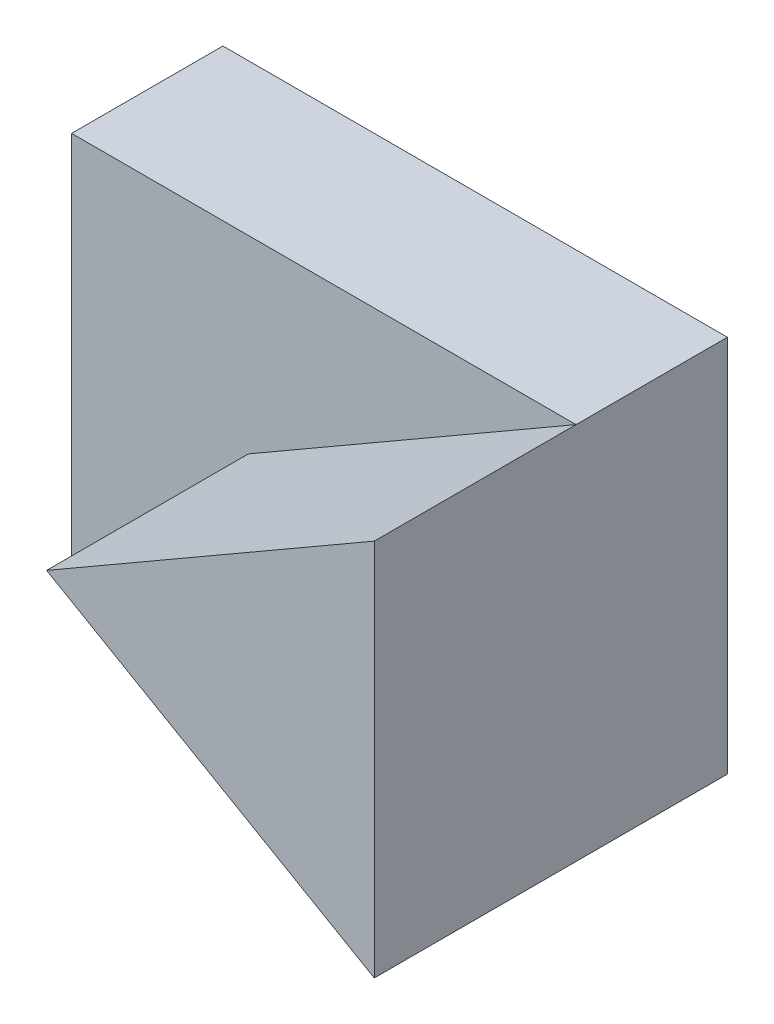
ISO-10303-21;
HEADER;
FILE_DESCRIPTION(('STEP AP214'),'2;1');
FILE_NAME('part.step','',(''),(''),'','','');
FILE_SCHEMA(('AUTOMOTIVE_DESIGN { 1 0 10303 214 1 1 1 1 }'));
ENDSEC;
DATA;
#1=APPLICATION_CONTEXT('core data for automotive mechanical design processes');
#2=APPLICATION_PROTOCOL_DEFINITION('international standard','automotive_design',2000,#1);
#3=PRODUCT_CONTEXT('',#1,'mechanical');
#4=PRODUCT('Part','Part','',(#3));
#5=PRODUCT_RELATED_PRODUCT_CATEGORY('part','',(#4));
#6=PRODUCT_DEFINITION_FORMATION('','',#4);
#7=PRODUCT_DEFINITION_CONTEXT('part definition',#1,'design');
#8=PRODUCT_DEFINITION('design','',#6,#7);
#9=PRODUCT_DEFINITION_SHAPE('','',#8);
#10=(LENGTH_UNIT() NAMED_UNIT(*) SI_UNIT(.MILLI.,.METRE.));
#11=(NAMED_UNIT(*) PLANE_ANGLE_UNIT() SI_UNIT($,.RADIAN.));
#12=(NAMED_UNIT(*) SI_UNIT($,.STERADIAN.) SOLID_ANGLE_UNIT());
#13=UNCERTAINTY_MEASURE_WITH_UNIT(LENGTH_MEASURE(1.E-05),#10,'distance_accuracy_value','');
#14=(GEOMETRIC_REPRESENTATION_CONTEXT(3) GLOBAL_UNCERTAINTY_ASSIGNED_CONTEXT((#13)) GLOBAL_UNIT_ASSIGNED_CONTEXT((#10,
#11,#12)) REPRESENTATION_CONTEXT('',''));
#15=CARTESIAN_POINT('',(0.,0.,0.));
#16=DIRECTION('',(0.,0.,1.));
#17=DIRECTION('',(1.,0.,0.));
#18=AXIS2_PLACEMENT_3D('',#15,#16,#17);
#19=CARTESIAN_POINT('',(0.,0.,3.));
#20=DIRECTION('',(0.,0.,1.));
#21=DIRECTION('',(1.,0.,0.));
#22=AXIS2_PLACEMENT_3D('',#19,#20,#21);
#23=PLANE('',#22);
#24=DIRECTION('',(1.,0.,0.));
#25=VECTOR('',#24,1.);
#26=CARTESIAN_POINT('',(-17.0149253731343,0.,3.));
#27=LINE('',#26,#25);
#28=CARTESIAN_POINT('',(-7.01492537313434,0.,3.));
#29=VERTEX_POINT('',#28);
#30=CARTESIAN_POINT('',(2.98507462686566,0.,3.));
#31=VERTEX_POINT('',#30);
#32=EDGE_CURVE('E149',#29,#31,#27,.T.);
#33=ORIENTED_EDGE('',*,*,#32,.T.);
#34=DIRECTION('',(0.866025403784439,-0.5,0.));
#35=VECTOR('',#34,1.);
#36=CARTESIAN_POINT('',(-10.0053064299009,7.5,3.));
#37=LINE('',#36,#35);
#38=CARTESIAN_POINT('',(-3.51011590151763,3.75,3.));
#39=VERTEX_POINT('',#38);
#40=EDGE_CURVE('E207',#39,#31,#37,.T.);
#41=ORIENTED_EDGE('',*,*,#40,.F.);
#42=DIRECTION('',(-0.682818860949668,-0.730587710772223,0.));
#43=VECTOR('',#42,1.);
#44=CARTESIAN_POINT('',(-3.51011590151763,3.75,3.));
#45=LINE('',#44,#43);
#46=EDGE_CURVE('E164',#39,#29,#45,.T.);
#47=ORIENTED_EDGE('',*,*,#46,.T.);
#48=EDGE_LOOP('',(#33,#41,#47));
#49=FACE_BOUND('',#48,.T.);
#50=ADVANCED_FACE('F64',(#49),#23,.T.);
#51=DIRECTION('',(-0.682818860949668,-0.730587710772223,0.));
#52=VECTOR('',#51,1.);
#53=CARTESIAN_POINT('',(-4.37614130530207,4.25,3.));
#54=LINE('',#53,#52);
#55=CARTESIAN_POINT('',(-4.37614130530207,4.25,3.));
#56=VERTEX_POINT('',#55);
#57=CARTESIAN_POINT('',(-7.88095077691878,0.5,3.));
#58=VERTEX_POINT('',#57);
#59=EDGE_CURVE('E82',#56,#58,#54,.T.);
#60=ORIENTED_EDGE('',*,*,#59,.F.);
#61=CARTESIAN_POINT('',(-10.0053064299009,7.5,3.));
#62=VERTEX_POINT('',#61);
#63=EDGE_CURVE('E209',#62,#56,#37,.T.);
#64=ORIENTED_EDGE('',*,*,#63,.F.);
#65=DIRECTION('',(-0.866025403784439,-0.5,0.));
#66=VECTOR('',#65,1.);
#67=CARTESIAN_POINT('',(2.98507462686566,15.,3.));
#68=LINE('',#67,#66);
#69=CARTESIAN_POINT('',(2.98507462686566,15.,3.));
#70=VERTEX_POINT('',#69);
#71=EDGE_CURVE('E191',#70,#62,#68,.T.);
#72=ORIENTED_EDGE('',*,*,#71,.F.);
#73=DIRECTION('',(-1.,0.,0.));
#74=VECTOR('',#73,1.);
#75=CARTESIAN_POINT('',(-17.0149253731343,15.,3.));
#76=LINE('',#75,#74);
#77=CARTESIAN_POINT('',(-17.0149253731343,15.,3.));
#78=VERTEX_POINT('',#77);
#79=EDGE_CURVE('E122',#70,#78,#76,.T.);
#80=ORIENTED_EDGE('',*,*,#79,.T.);
#81=DIRECTION('',(0.,-1.,0.));
#82=VECTOR('',#81,1.);
#83=CARTESIAN_POINT('',(-17.0149253731343,15.,3.));
#84=LINE('',#83,#82);
#85=CARTESIAN_POINT('',(-17.0149253731343,0.,3.));
#86=VERTEX_POINT('',#85);
#87=EDGE_CURVE('E91',#78,#86,#84,.T.);
#88=ORIENTED_EDGE('',*,*,#87,.T.);
#89=EDGE_CURVE('E68',#86,#29,#27,.T.);
#90=ORIENTED_EDGE('',*,*,#89,.T.);
#91=DIRECTION('',(-0.866025403784439,0.5,0.));
#92=VECTOR('',#91,1.);
#93=CARTESIAN_POINT('',(-7.01492537313434,0.,3.));
#94=LINE('',#93,#92);
#95=EDGE_CURVE('E157',#29,#58,#94,.T.);
#96=ORIENTED_EDGE('',*,*,#95,.T.);
#97=EDGE_LOOP('',(#60,#64,#72,#80,#88,#90,#96));
#98=FACE_BOUND('',#97,.T.);
#99=ADVANCED_FACE('F233',(#98),#23,.T.);
#100=CARTESIAN_POINT('',(2.98507462686566,15.,3.));
#101=DIRECTION('',(-1.,0.,0.));
#102=DIRECTION('',(0.,-1.,0.));
#103=AXIS2_PLACEMENT_3D('',#100,#101,#102);
#104=PLANE('',#103);
#105=DIRECTION('',(0.,1.,0.));
#106=VECTOR('',#105,1.);
#107=CARTESIAN_POINT('',(2.98507462686566,15.,-3.));
#108=LINE('',#107,#106);
#109=CARTESIAN_POINT('',(2.98507462686566,0.,-3.));
#110=VERTEX_POINT('',#109);
#111=CARTESIAN_POINT('',(2.98507462686566,15.,-3.));
#112=VERTEX_POINT('',#111);
#113=EDGE_CURVE('E129',#110,#112,#108,.T.);
#114=ORIENTED_EDGE('',*,*,#113,.T.);
#115=DIRECTION('',(0.,0.,-1.));
#116=VECTOR('',#115,1.);
#117=CARTESIAN_POINT('',(2.98507462686566,15.,3.));
#118=LINE('',#117,#116);
#119=EDGE_CURVE('E12',#70,#112,#118,.T.);
#120=ORIENTED_EDGE('',*,*,#119,.F.);
#121=DIRECTION('',(0.,0.,-1.));
#122=VECTOR('',#121,1.);
#123=CARTESIAN_POINT('',(2.98507462686566,15.,11.));
#124=LINE('',#123,#122);
#125=CARTESIAN_POINT('',(2.98507462686566,15.,11.));
#126=VERTEX_POINT('',#125);
#127=EDGE_CURVE('E213',#126,#70,#124,.T.);
#128=ORIENTED_EDGE('',*,*,#127,.F.);
#129=DIRECTION('',(0.,1.,0.));
#130=VECTOR('',#129,1.);
#131=CARTESIAN_POINT('',(2.98507462686566,0.,11.));
#132=LINE('',#131,#130);
#133=CARTESIAN_POINT('',(2.98507462686566,0.,11.));
#134=VERTEX_POINT('',#133);
#135=EDGE_CURVE('E195',#134,#126,#132,.T.);
#136=ORIENTED_EDGE('',*,*,#135,.F.);
#137=DIRECTION('',(0.,0.,-1.));
#138=VECTOR('',#137,1.);
#139=CARTESIAN_POINT('',(2.98507462686566,0.,11.));
#140=LINE('',#139,#138);
#141=EDGE_CURVE('E132',#134,#31,#140,.T.);
#142=ORIENTED_EDGE('',*,*,#141,.T.);
#143=DIRECTION('',(0.,0.,-1.));
#144=VECTOR('',#143,1.);
#145=CARTESIAN_POINT('',(2.98507462686566,0.,3.));
#146=LINE('',#145,#144);
#147=EDGE_CURVE('E116',#31,#110,#146,.T.);
#148=ORIENTED_EDGE('',*,*,#147,.T.);
#149=EDGE_LOOP('',(#114,#120,#128,#136,#142,#148));
#150=FACE_BOUND('',#149,.T.);
#151=ADVANCED_FACE('F66',(#150),#104,.F.);
#152=CARTESIAN_POINT('',(-17.0149253731343,15.,3.));
#153=DIRECTION('',(0.,-1.,0.));
#154=DIRECTION('',(0.,0.,-1.));
#155=AXIS2_PLACEMENT_3D('',#152,#153,#154);
#156=PLANE('',#155);
#157=DIRECTION('',(-1.,0.,0.));
#158=VECTOR('',#157,1.);
#159=CARTESIAN_POINT('',(-17.0149253731343,15.,-3.));
#160=LINE('',#159,#158);
#161=CARTESIAN_POINT('',(-17.0149253731343,15.,-3.));
#162=VERTEX_POINT('',#161);
#163=EDGE_CURVE('E136',#112,#162,#160,.T.);
#164=ORIENTED_EDGE('',*,*,#163,.T.);
#165=DIRECTION('',(0.,0.,-1.));
#166=VECTOR('',#165,1.);
#167=CARTESIAN_POINT('',(-17.0149253731343,15.,3.));
#168=LINE('',#167,#166);
#169=EDGE_CURVE('E74',#78,#162,#168,.T.);
#170=ORIENTED_EDGE('',*,*,#169,.F.);
#171=ORIENTED_EDGE('',*,*,#79,.F.);
#172=ORIENTED_EDGE('',*,*,#119,.T.);
#173=EDGE_LOOP('',(#164,#170,#171,#172));
#174=FACE_BOUND('',#173,.T.);
#175=ADVANCED_FACE('F278',(#174),#156,.F.);
#176=CARTESIAN_POINT('',(-17.0149253731343,15.,3.));
#177=DIRECTION('',(1.,0.,0.));
#178=DIRECTION('',(0.,1.,0.));
#179=AXIS2_PLACEMENT_3D('',#176,#177,#178);
#180=PLANE('',#179);
#181=DIRECTION('',(0.,-1.,0.));
#182=VECTOR('',#181,1.);
#183=CARTESIAN_POINT('',(-17.0149253731343,15.,-3.));
#184=LINE('',#183,#182);
#185=CARTESIAN_POINT('',(-17.0149253731343,0.,-3.));
#186=VERTEX_POINT('',#185);
#187=EDGE_CURVE('E123',#162,#186,#184,.T.);
#188=ORIENTED_EDGE('',*,*,#187,.T.);
#189=DIRECTION('',(0.,0.,-1.));
#190=VECTOR('',#189,1.);
#191=CARTESIAN_POINT('',(-17.0149253731343,0.,3.));
#192=LINE('',#191,#190);
#193=EDGE_CURVE('E118',#86,#186,#192,.T.);
#194=ORIENTED_EDGE('',*,*,#193,.F.);
#195=ORIENTED_EDGE('',*,*,#87,.F.);
#196=ORIENTED_EDGE('',*,*,#169,.T.);
#197=EDGE_LOOP('',(#188,#194,#195,#196));
#198=FACE_BOUND('',#197,.T.);
#199=ADVANCED_FACE('F276',(#198),#180,.F.);
#200=CARTESIAN_POINT('',(-17.0149253731343,0.,3.));
#201=DIRECTION('',(0.,1.,0.));
#202=DIRECTION('',(0.,0.,1.));
#203=AXIS2_PLACEMENT_3D('',#200,#201,#202);
#204=PLANE('',#203);
#205=DIRECTION('',(1.,0.,0.));
#206=VECTOR('',#205,1.);
#207=CARTESIAN_POINT('',(-17.0149253731343,0.,-3.));
#208=LINE('',#207,#206);
#209=EDGE_CURVE('E111',#186,#110,#208,.T.);
#210=ORIENTED_EDGE('',*,*,#209,.T.);
#211=ORIENTED_EDGE('',*,*,#147,.F.);
#212=ORIENTED_EDGE('',*,*,#32,.F.);
#213=ORIENTED_EDGE('',*,*,#89,.F.);
#214=ORIENTED_EDGE('',*,*,#193,.T.);
#215=EDGE_LOOP('',(#210,#211,#212,#213,#214));
#216=FACE_BOUND('',#215,.T.);
#217=ADVANCED_FACE('F113',(#216),#204,.F.);
#218=CARTESIAN_POINT('',(0.,0.,-3.));
#219=DIRECTION('',(0.,0.,1.));
#220=DIRECTION('',(1.,0.,0.));
#221=AXIS2_PLACEMENT_3D('',#218,#219,#220);
#222=PLANE('',#221);
#223=ORIENTED_EDGE('',*,*,#113,.F.);
#224=ORIENTED_EDGE('',*,*,#209,.F.);
#225=ORIENTED_EDGE('',*,*,#187,.F.);
#226=ORIENTED_EDGE('',*,*,#163,.F.);
#227=EDGE_LOOP('',(#223,#224,#225,#226));
#228=FACE_BOUND('',#227,.T.);
#229=ADVANCED_FACE('F135',(#228),#222,.F.);
#230=CARTESIAN_POINT('',(-4.61030076903455,3.99945913719192,0.));
#231=DIRECTION('',(0.730587710772223,-0.682818860949669,0.));
#232=DIRECTION('',(0.682818860949669,0.730587710772223,0.));
#233=AXIS2_PLACEMENT_3D('',#230,#231,#232);
#234=PLANE('',#233);
#235=DIRECTION('',(0.,0.,-1.));
#236=VECTOR('',#235,1.);
#237=CARTESIAN_POINT('',(-4.37614130530207,4.25,11.));
#238=LINE('',#237,#236);
#239=CARTESIAN_POINT('',(-4.37614130530207,4.25,11.));
#240=VERTEX_POINT('',#239);
#241=EDGE_CURVE('E141',#240,#56,#238,.T.);
#242=ORIENTED_EDGE('',*,*,#241,.T.);
#243=ORIENTED_EDGE('',*,*,#59,.T.);
#244=DIRECTION('',(-0.368730866446014,-0.394526652695537,-0.841656859083812));
#245=VECTOR('',#244,1.);
#246=CARTESIAN_POINT('',(-4.37614130530207,4.25,11.));
#247=LINE('',#246,#245);
#248=EDGE_CURVE('E167',#240,#58,#247,.T.);
#249=ORIENTED_EDGE('',*,*,#248,.F.);
#250=EDGE_LOOP('',(#242,#243,#249));
#251=FACE_BOUND('',#250,.T.);
#252=ADVANCED_FACE('F254',(#251),#234,.F.);
#253=CARTESIAN_POINT('',(-3.74427536525011,3.49945913719192,0.));
#254=DIRECTION('',(0.730587710772223,-0.682818860949669,0.));
#255=DIRECTION('',(0.682818860949669,0.730587710772223,0.));
#256=AXIS2_PLACEMENT_3D('',#253,#254,#255);
#257=PLANE('',#256);
#258=DIRECTION('',(0.,0.,-1.));
#259=VECTOR('',#258,1.);
#260=CARTESIAN_POINT('',(-3.51011590151763,3.75,11.));
#261=LINE('',#260,#259);
#262=CARTESIAN_POINT('',(-3.51011590151763,3.75,11.));
#263=VERTEX_POINT('',#262);
#264=EDGE_CURVE('E137',#263,#39,#261,.T.);
#265=ORIENTED_EDGE('',*,*,#264,.F.);
#266=DIRECTION('',(-0.368730866446014,-0.394526652695537,-0.841656859083812));
#267=VECTOR('',#266,1.);
#268=CARTESIAN_POINT('',(-3.51011590151763,3.75,11.));
#269=LINE('',#268,#267);
#270=EDGE_CURVE('E160',#263,#29,#269,.T.);
#271=ORIENTED_EDGE('',*,*,#270,.T.);
#272=ORIENTED_EDGE('',*,*,#46,.F.);
#273=EDGE_LOOP('',(#265,#271,#272));
#274=FACE_BOUND('',#273,.T.);
#275=ADVANCED_FACE('F256',(#274),#257,.T.);
#276=CARTESIAN_POINT('',(-3.51011590151763,3.75,11.));
#277=DIRECTION('',(0.423999152002544,0.734388073634526,-0.52999894000318));
#278=DIRECTION('',(0.,0.585205735980653,0.810884854079383));
#279=AXIS2_PLACEMENT_3D('',#276,#277,#278);
#280=PLANE('',#279);
#281=ORIENTED_EDGE('',*,*,#248,.T.);
#282=ORIENTED_EDGE('',*,*,#95,.F.);
#283=ORIENTED_EDGE('',*,*,#270,.F.);
#284=DIRECTION('',(-0.866025403784439,0.5,0.));
#285=VECTOR('',#284,1.);
#286=CARTESIAN_POINT('',(-3.51011590151763,3.75,11.));
#287=LINE('',#286,#285);
#288=EDGE_CURVE('E169',#263,#240,#287,.T.);
#289=ORIENTED_EDGE('',*,*,#288,.T.);
#290=EDGE_LOOP('',(#281,#282,#283,#289));
#291=FACE_BOUND('',#290,.T.);
#292=ADVANCED_FACE('F252',(#291),#280,.F.);
#293=CARTESIAN_POINT('',(-10.0053064299009,7.5,11.));
#294=DIRECTION('',(0.5,0.866025403784439,0.));
#295=DIRECTION('',(-0.866025403784439,0.5,0.));
#296=AXIS2_PLACEMENT_3D('',#293,#294,#295);
#297=PLANE('',#296);
#298=ORIENTED_EDGE('',*,*,#63,.T.);
#299=ORIENTED_EDGE('',*,*,#241,.F.);
#300=DIRECTION('',(0.866025403784439,-0.5,0.));
#301=VECTOR('',#300,1.);
#302=CARTESIAN_POINT('',(-10.0053064299009,7.5,11.));
#303=LINE('',#302,#301);
#304=CARTESIAN_POINT('',(-10.0053064299009,7.5,11.));
#305=VERTEX_POINT('',#304);
#306=EDGE_CURVE('E190',#305,#240,#303,.T.);
#307=ORIENTED_EDGE('',*,*,#306,.F.);
#308=DIRECTION('',(0.,0.,-1.));
#309=VECTOR('',#308,1.);
#310=CARTESIAN_POINT('',(-10.0053064299009,7.5,11.));
#311=LINE('',#310,#309);
#312=EDGE_CURVE('E202',#305,#62,#311,.T.);
#313=ORIENTED_EDGE('',*,*,#312,.T.);
#314=EDGE_LOOP('',(#298,#299,#307,#313));
#315=FACE_BOUND('',#314,.T.);
#316=ADVANCED_FACE('F221',(#315),#297,.F.);
#317=ORIENTED_EDGE('',*,*,#264,.T.);
#318=ORIENTED_EDGE('',*,*,#40,.T.);
#319=ORIENTED_EDGE('',*,*,#141,.F.);
#320=EDGE_CURVE('E186',#263,#134,#303,.T.);
#321=ORIENTED_EDGE('',*,*,#320,.F.);
#322=EDGE_LOOP('',(#317,#318,#319,#321));
#323=FACE_BOUND('',#322,.T.);
#324=ADVANCED_FACE('F267',(#323),#297,.F.);
#325=CARTESIAN_POINT('',(2.98507462686566,15.,11.));
#326=DIRECTION('',(0.5,-0.866025403784439,0.));
#327=DIRECTION('',(0.866025403784439,0.5,0.));
#328=AXIS2_PLACEMENT_3D('',#325,#326,#327);
#329=PLANE('',#328);
#330=ORIENTED_EDGE('',*,*,#71,.T.);
#331=ORIENTED_EDGE('',*,*,#312,.F.);
#332=DIRECTION('',(-0.866025403784439,-0.5,0.));
#333=VECTOR('',#332,1.);
#334=CARTESIAN_POINT('',(2.98507462686566,15.,11.));
#335=LINE('',#334,#333);
#336=EDGE_CURVE('E199',#126,#305,#335,.T.);
#337=ORIENTED_EDGE('',*,*,#336,.F.);
#338=ORIENTED_EDGE('',*,*,#127,.T.);
#339=EDGE_LOOP('',(#330,#331,#337,#338));
#340=FACE_BOUND('',#339,.T.);
#341=ADVANCED_FACE('F294',(#340),#329,.F.);
#342=CARTESIAN_POINT('',(0.,0.,11.));
#343=DIRECTION('',(0.,0.,1.));
#344=DIRECTION('',(1.,0.,0.));
#345=AXIS2_PLACEMENT_3D('',#342,#343,#344);
#346=PLANE('',#345);
#347=ORIENTED_EDGE('',*,*,#306,.T.);
#348=ORIENTED_EDGE('',*,*,#288,.F.);
#349=ORIENTED_EDGE('',*,*,#320,.T.);
#350=ORIENTED_EDGE('',*,*,#135,.T.);
#351=ORIENTED_EDGE('',*,*,#336,.T.);
#352=EDGE_LOOP('',(#347,#348,#349,#350,#351));
#353=FACE_BOUND('',#352,.T.);
#354=ADVANCED_FACE('F249',(#353),#346,.T.);
#355=CLOSED_SHELL('',(#50,#99,#151,#175,#199,#217,#229,#252,#275,#292,#316,#324,#341,#354));
#356=MANIFOLD_SOLID_BREP('B2',#355);
#357=ADVANCED_BREP_SHAPE_REPRESENTATION('',(#18,#356),#14);
#358=SHAPE_DEFINITION_REPRESENTATION(#9,#357);
ENDSEC;
END-ISO-10303-21;
